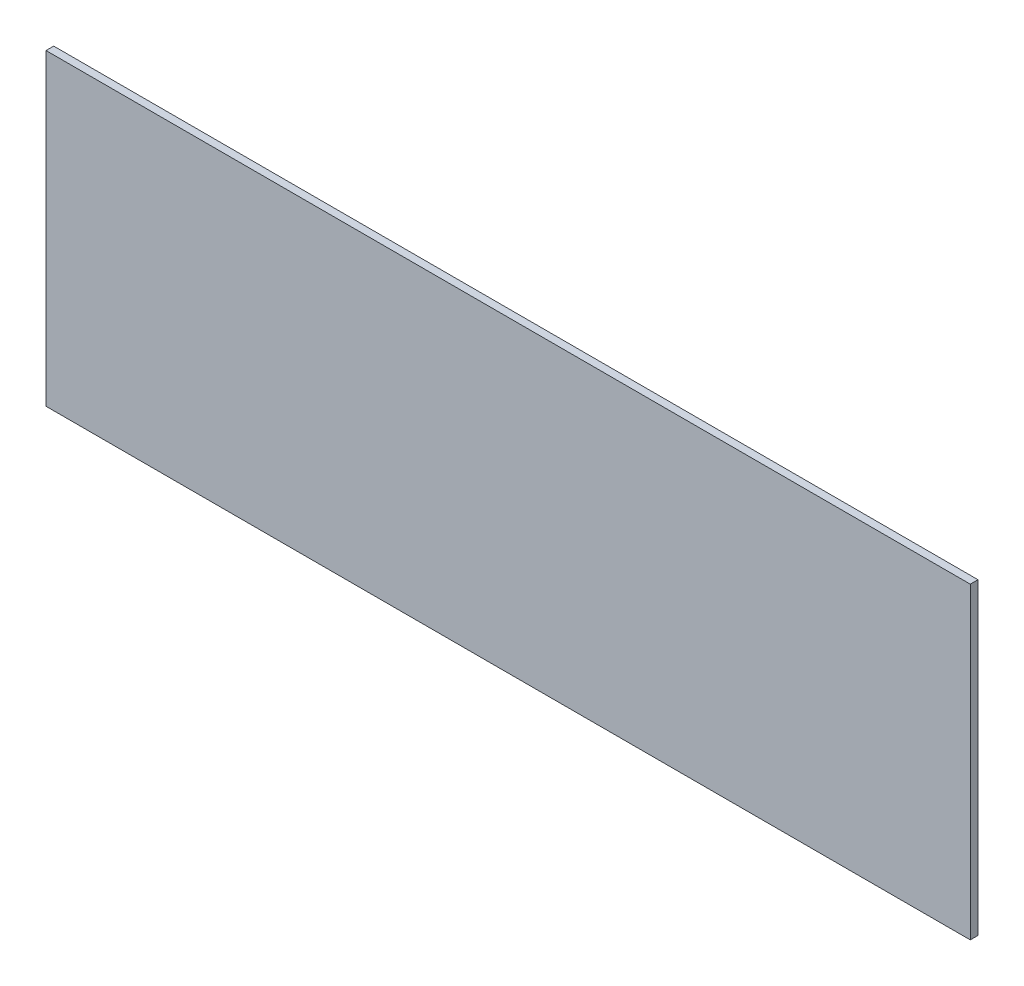
ISO-10303-21;
HEADER;
FILE_DESCRIPTION(('STEP AP214'),'2;1');
FILE_NAME('part.step','',(''),(''),'','','');
FILE_SCHEMA(('AUTOMOTIVE_DESIGN { 1 0 10303 214 1 1 1 1 }'));
ENDSEC;
DATA;
#1=APPLICATION_CONTEXT('core data for automotive mechanical design processes');
#2=APPLICATION_PROTOCOL_DEFINITION('international standard','automotive_design',2000,#1);
#3=PRODUCT_CONTEXT('',#1,'mechanical');
#4=PRODUCT('Part','Part','',(#3));
#5=PRODUCT_RELATED_PRODUCT_CATEGORY('part','',(#4));
#6=PRODUCT_DEFINITION_FORMATION('','',#4);
#7=PRODUCT_DEFINITION_CONTEXT('part definition',#1,'design');
#8=PRODUCT_DEFINITION('design','',#6,#7);
#9=PRODUCT_DEFINITION_SHAPE('','',#8);
#10=(LENGTH_UNIT() NAMED_UNIT(*) SI_UNIT(.MILLI.,.METRE.));
#11=(NAMED_UNIT(*) PLANE_ANGLE_UNIT() SI_UNIT($,.RADIAN.));
#12=(NAMED_UNIT(*) SI_UNIT($,.STERADIAN.) SOLID_ANGLE_UNIT());
#13=UNCERTAINTY_MEASURE_WITH_UNIT(LENGTH_MEASURE(1.E-05),#10,'distance_accuracy_value','');
#14=(GEOMETRIC_REPRESENTATION_CONTEXT(3) GLOBAL_UNCERTAINTY_ASSIGNED_CONTEXT((#13)) GLOBAL_UNIT_ASSIGNED_CONTEXT((#10,
#11,#12)) REPRESENTATION_CONTEXT('',''));
#15=CARTESIAN_POINT('',(0.,0.,0.));
#16=DIRECTION('',(0.,0.,1.));
#17=DIRECTION('',(1.,0.,0.));
#18=AXIS2_PLACEMENT_3D('',#15,#16,#17);
#19=CARTESIAN_POINT('',(-300.,200.,5.));
#20=DIRECTION('',(1.,0.,0.));
#21=DIRECTION('',(0.,1.,0.));
#22=AXIS2_PLACEMENT_3D('',#19,#20,#21);
#23=PLANE('',#22);
#24=DIRECTION('',(0.,-1.,0.));
#25=VECTOR('',#24,1.);
#26=CARTESIAN_POINT('',(-300.,200.,0.));
#27=LINE('',#26,#25);
#28=CARTESIAN_POINT('',(-300.,200.,0.));
#29=VERTEX_POINT('',#28);
#30=CARTESIAN_POINT('',(-300.,-1.0052214124217E-13,0.));
#31=VERTEX_POINT('',#30);
#32=EDGE_CURVE('E94',#29,#31,#27,.T.);
#33=ORIENTED_EDGE('',*,*,#32,.T.);
#34=DIRECTION('',(0.,0.,-1.));
#35=VECTOR('',#34,1.);
#36=CARTESIAN_POINT('',(-300.,-1.0052214124217E-13,5.));
#37=LINE('',#36,#35);
#38=CARTESIAN_POINT('',(-300.,-1.0052214124217E-13,5.));
#39=VERTEX_POINT('',#38);
#40=EDGE_CURVE('E11',#39,#31,#37,.T.);
#41=ORIENTED_EDGE('',*,*,#40,.F.);
#42=DIRECTION('',(0.,-1.,0.));
#43=VECTOR('',#42,1.);
#44=CARTESIAN_POINT('',(-300.,200.,5.));
#45=LINE('',#44,#43);
#46=CARTESIAN_POINT('',(-300.,200.,5.));
#47=VERTEX_POINT('',#46);
#48=EDGE_CURVE('E82',#47,#39,#45,.T.);
#49=ORIENTED_EDGE('',*,*,#48,.F.);
#50=DIRECTION('',(0.,0.,-1.));
#51=VECTOR('',#50,1.);
#52=CARTESIAN_POINT('',(-300.,200.,5.));
#53=LINE('',#52,#51);
#54=EDGE_CURVE('E90',#47,#29,#53,.T.);
#55=ORIENTED_EDGE('',*,*,#54,.T.);
#56=EDGE_LOOP('',(#33,#41,#49,#55));
#57=FACE_BOUND('',#56,.T.);
#58=ADVANCED_FACE('F31',(#57),#23,.F.);
#59=CARTESIAN_POINT('',(300.,-1.0052214124217E-13,5.));
#60=DIRECTION('',(0.,1.,0.));
#61=DIRECTION('',(0.,0.,1.));
#62=AXIS2_PLACEMENT_3D('',#59,#60,#61);
#63=PLANE('',#62);
#64=DIRECTION('',(1.,0.,0.));
#65=VECTOR('',#64,1.);
#66=CARTESIAN_POINT('',(300.,-1.0052214124217E-13,0.));
#67=LINE('',#66,#65);
#68=CARTESIAN_POINT('',(300.,-1.0052214124217E-13,0.));
#69=VERTEX_POINT('',#68);
#70=EDGE_CURVE('E86',#31,#69,#67,.T.);
#71=ORIENTED_EDGE('',*,*,#70,.T.);
#72=DIRECTION('',(0.,0.,-1.));
#73=VECTOR('',#72,1.);
#74=CARTESIAN_POINT('',(300.,-1.0052214124217E-13,5.));
#75=LINE('',#74,#73);
#76=CARTESIAN_POINT('',(300.,-1.0052214124217E-13,5.));
#77=VERTEX_POINT('',#76);
#78=EDGE_CURVE('E39',#77,#69,#75,.T.);
#79=ORIENTED_EDGE('',*,*,#78,.F.);
#80=DIRECTION('',(1.,0.,0.));
#81=VECTOR('',#80,1.);
#82=CARTESIAN_POINT('',(300.,-1.0052214124217E-13,5.));
#83=LINE('',#82,#81);
#84=EDGE_CURVE('E77',#39,#77,#83,.T.);
#85=ORIENTED_EDGE('',*,*,#84,.F.);
#86=ORIENTED_EDGE('',*,*,#40,.T.);
#87=EDGE_LOOP('',(#71,#79,#85,#86));
#88=FACE_BOUND('',#87,.T.);
#89=ADVANCED_FACE('F85',(#88),#63,.F.);
#90=CARTESIAN_POINT('',(300.,200.,5.));
#91=DIRECTION('',(-1.,0.,0.));
#92=DIRECTION('',(0.,-1.,0.));
#93=AXIS2_PLACEMENT_3D('',#90,#91,#92);
#94=PLANE('',#93);
#95=DIRECTION('',(0.,1.,0.));
#96=VECTOR('',#95,1.);
#97=CARTESIAN_POINT('',(300.,200.,0.));
#98=LINE('',#97,#96);
#99=CARTESIAN_POINT('',(300.,200.,0.));
#100=VERTEX_POINT('',#99);
#101=EDGE_CURVE('E64',#69,#100,#98,.T.);
#102=ORIENTED_EDGE('',*,*,#101,.T.);
#103=DIRECTION('',(0.,0.,-1.));
#104=VECTOR('',#103,1.);
#105=CARTESIAN_POINT('',(300.,200.,5.));
#106=LINE('',#105,#104);
#107=CARTESIAN_POINT('',(300.,200.,5.));
#108=VERTEX_POINT('',#107);
#109=EDGE_CURVE('E87',#108,#100,#106,.T.);
#110=ORIENTED_EDGE('',*,*,#109,.F.);
#111=DIRECTION('',(0.,1.,0.));
#112=VECTOR('',#111,1.);
#113=CARTESIAN_POINT('',(300.,200.,5.));
#114=LINE('',#113,#112);
#115=EDGE_CURVE('E80',#77,#108,#114,.T.);
#116=ORIENTED_EDGE('',*,*,#115,.F.);
#117=ORIENTED_EDGE('',*,*,#78,.T.);
#118=EDGE_LOOP('',(#102,#110,#116,#117));
#119=FACE_BOUND('',#118,.T.);
#120=ADVANCED_FACE('F88',(#119),#94,.F.);
#121=CARTESIAN_POINT('',(300.,200.,5.));
#122=DIRECTION('',(0.,-1.,0.));
#123=DIRECTION('',(0.,0.,-1.));
#124=AXIS2_PLACEMENT_3D('',#121,#122,#123);
#125=PLANE('',#124);
#126=DIRECTION('',(-1.,0.,0.));
#127=VECTOR('',#126,1.);
#128=CARTESIAN_POINT('',(300.,200.,0.));
#129=LINE('',#128,#127);
#130=EDGE_CURVE('E70',#100,#29,#129,.T.);
#131=ORIENTED_EDGE('',*,*,#130,.T.);
#132=ORIENTED_EDGE('',*,*,#54,.F.);
#133=DIRECTION('',(-1.,0.,0.));
#134=VECTOR('',#133,1.);
#135=CARTESIAN_POINT('',(300.,200.,5.));
#136=LINE('',#135,#134);
#137=EDGE_CURVE('E47',#108,#47,#136,.T.);
#138=ORIENTED_EDGE('',*,*,#137,.F.);
#139=ORIENTED_EDGE('',*,*,#109,.T.);
#140=EDGE_LOOP('',(#131,#132,#138,#139));
#141=FACE_BOUND('',#140,.T.);
#142=ADVANCED_FACE('F101',(#141),#125,.F.);
#143=CARTESIAN_POINT('',(-300.,-1.0052214124217E-13,5.));
#144=DIRECTION('',(0.,0.,-1.));
#145=DIRECTION('',(-1.,0.,0.));
#146=AXIS2_PLACEMENT_3D('',#143,#144,#145);
#147=PLANE('',#146);
#148=ORIENTED_EDGE('',*,*,#48,.T.);
#149=ORIENTED_EDGE('',*,*,#84,.T.);
#150=ORIENTED_EDGE('',*,*,#115,.T.);
#151=ORIENTED_EDGE('',*,*,#137,.T.);
#152=EDGE_LOOP('',(#148,#149,#150,#151));
#153=FACE_BOUND('',#152,.T.);
#154=ADVANCED_FACE('F78',(#153),#147,.F.);
#155=CARTESIAN_POINT('',(-300.,-1.0052214124217E-13,0.));
#156=DIRECTION('',(0.,0.,-1.));
#157=DIRECTION('',(-1.,0.,0.));
#158=AXIS2_PLACEMENT_3D('',#155,#156,#157);
#159=PLANE('',#158);
#160=ORIENTED_EDGE('',*,*,#32,.F.);
#161=ORIENTED_EDGE('',*,*,#130,.F.);
#162=ORIENTED_EDGE('',*,*,#101,.F.);
#163=ORIENTED_EDGE('',*,*,#70,.F.);
#164=EDGE_LOOP('',(#160,#161,#162,#163));
#165=FACE_BOUND('',#164,.T.);
#166=ADVANCED_FACE('F104',(#165),#159,.T.);
#167=CLOSED_SHELL('',(#58,#89,#120,#142,#154,#166));
#168=MANIFOLD_SOLID_BREP('B2',#167);
#169=ADVANCED_BREP_SHAPE_REPRESENTATION('',(#18,#168),#14);
#170=SHAPE_DEFINITION_REPRESENTATION(#9,#169);
ENDSEC;
END-ISO-10303-21;
